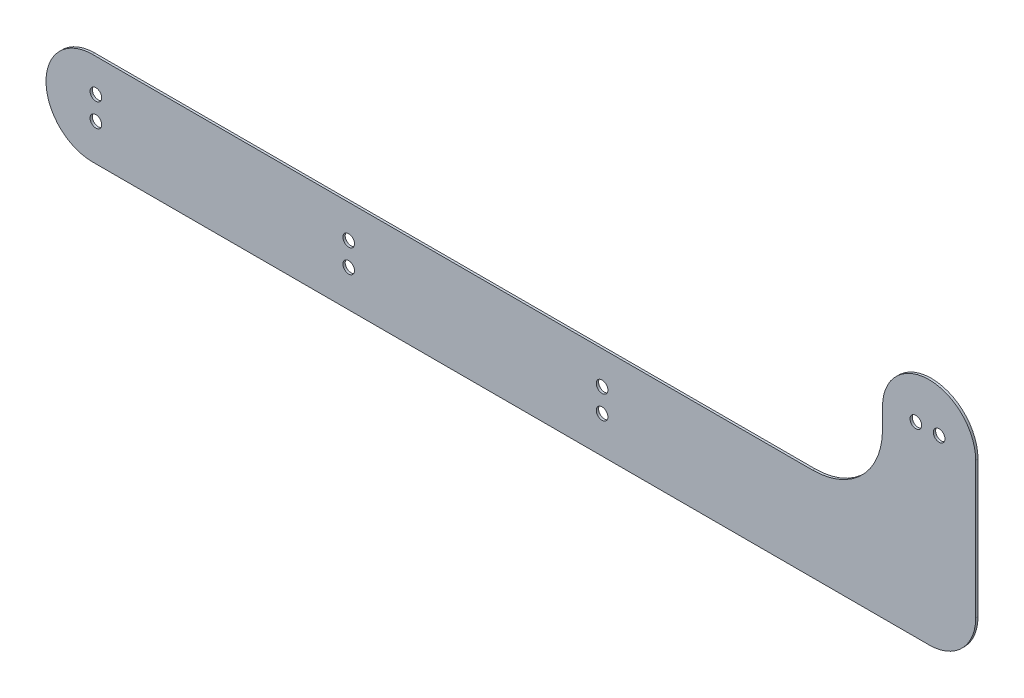
ISO-10303-21;
HEADER;
FILE_DESCRIPTION(('STEP AP214'),'2;1');
FILE_NAME('part.step','',(''),(''),'','','');
FILE_SCHEMA(('AUTOMOTIVE_DESIGN { 1 0 10303 214 1 1 1 1 }'));
ENDSEC;
DATA;
#1=APPLICATION_CONTEXT('core data for automotive mechanical design processes');
#2=APPLICATION_PROTOCOL_DEFINITION('international standard','automotive_design',2000,#1);
#3=PRODUCT_CONTEXT('',#1,'mechanical');
#4=PRODUCT('Part','Part','',(#3));
#5=PRODUCT_RELATED_PRODUCT_CATEGORY('part','',(#4));
#6=PRODUCT_DEFINITION_FORMATION('','',#4);
#7=PRODUCT_DEFINITION_CONTEXT('part definition',#1,'design');
#8=PRODUCT_DEFINITION('design','',#6,#7);
#9=PRODUCT_DEFINITION_SHAPE('','',#8);
#10=(LENGTH_UNIT() NAMED_UNIT(*) SI_UNIT(.MILLI.,.METRE.));
#11=(NAMED_UNIT(*) PLANE_ANGLE_UNIT() SI_UNIT($,.RADIAN.));
#12=(NAMED_UNIT(*) SI_UNIT($,.STERADIAN.) SOLID_ANGLE_UNIT());
#13=UNCERTAINTY_MEASURE_WITH_UNIT(LENGTH_MEASURE(1.E-05),#10,'distance_accuracy_value','');
#14=(GEOMETRIC_REPRESENTATION_CONTEXT(3) GLOBAL_UNCERTAINTY_ASSIGNED_CONTEXT((#13)) GLOBAL_UNIT_ASSIGNED_CONTEXT((#10,
#11,#12)) REPRESENTATION_CONTEXT('',''));
#15=CARTESIAN_POINT('',(0.,0.,0.));
#16=DIRECTION('',(0.,0.,1.));
#17=DIRECTION('',(1.,0.,0.));
#18=AXIS2_PLACEMENT_3D('',#15,#16,#17);
#19=CARTESIAN_POINT('',(422.807330172387,0.,1.));
#20=DIRECTION('',(-1.,0.,0.));
#21=DIRECTION('',(0.,0.,1.));
#22=AXIS2_PLACEMENT_3D('',#19,#20,#21);
#23=PLANE('',#22);
#24=DIRECTION('',(0.,1.,0.));
#25=VECTOR('',#24,1.);
#26=CARTESIAN_POINT('',(422.807330172387,0.,0.));
#27=LINE('',#26,#25);
#28=CARTESIAN_POINT('',(422.807330172387,62.2716161393578,0.));
#29=VERTEX_POINT('',#28);
#30=CARTESIAN_POINT('',(422.807330172387,70.9000000000001,0.));
#31=VERTEX_POINT('',#30);
#32=EDGE_CURVE('E170',#29,#31,#27,.T.);
#33=ORIENTED_EDGE('',*,*,#32,.F.);
#34=DIRECTION('',(0.,0.,-1.));
#35=VECTOR('',#34,1.);
#36=CARTESIAN_POINT('',(422.807330172387,62.2716161393578,1.));
#37=LINE('',#36,#35);
#38=CARTESIAN_POINT('',(422.807330172387,62.2716161393578,1.));
#39=VERTEX_POINT('',#38);
#40=EDGE_CURVE('E11',#39,#29,#37,.T.);
#41=ORIENTED_EDGE('',*,*,#40,.F.);
#42=DIRECTION('',(0.,1.,0.));
#43=VECTOR('',#42,1.);
#44=CARTESIAN_POINT('',(422.807330172387,0.,1.));
#45=LINE('',#44,#43);
#46=CARTESIAN_POINT('',(422.807330172387,70.9000000000001,1.));
#47=VERTEX_POINT('',#46);
#48=EDGE_CURVE('E466',#39,#47,#45,.T.);
#49=ORIENTED_EDGE('',*,*,#48,.T.);
#50=DIRECTION('',(0.,0.,-1.));
#51=VECTOR('',#50,1.);
#52=CARTESIAN_POINT('',(422.807330172387,70.9000000000001,1.));
#53=LINE('',#52,#51);
#54=EDGE_CURVE('E97',#47,#31,#53,.T.);
#55=ORIENTED_EDGE('',*,*,#54,.T.);
#56=EDGE_LOOP('',(#33,#41,#49,#55));
#57=FACE_BOUND('',#56,.T.);
#58=ADVANCED_FACE('F45',(#57),#23,.T.);
#59=CARTESIAN_POINT('',(392.807330172387,62.2716161393576,1.));
#60=DIRECTION('',(0.,0.,-1.));
#61=DIRECTION('',(-1.,0.,0.));
#62=AXIS2_PLACEMENT_3D('',#59,#60,#61);
#63=CYLINDRICAL_SURFACE('',#62,30.);
#64=CARTESIAN_POINT('',(392.807330172387,62.2716161393576,0.));
#65=DIRECTION('',(0.,0.,1.));
#66=DIRECTION('',(1.,0.,0.));
#67=AXIS2_PLACEMENT_3D('',#64,#65,#66);
#68=CIRCLE('',#67,30.);
#69=CARTESIAN_POINT('',(392.807330172387,32.2716161393576,0.));
#70=VERTEX_POINT('',#69);
#71=EDGE_CURVE('E167',#29,#70,#68,.F.);
#72=ORIENTED_EDGE('',*,*,#71,.T.);
#73=DIRECTION('',(0.,0.,-1.));
#74=VECTOR('',#73,1.);
#75=CARTESIAN_POINT('',(392.807330172387,32.2716161393576,1.));
#76=LINE('',#75,#74);
#77=CARTESIAN_POINT('',(392.807330172387,32.2716161393576,1.));
#78=VERTEX_POINT('',#77);
#79=EDGE_CURVE('E55',#78,#70,#76,.T.);
#80=ORIENTED_EDGE('',*,*,#79,.F.);
#81=CARTESIAN_POINT('',(392.807330172387,62.2716161393576,1.));
#82=DIRECTION('',(0.,0.,1.));
#83=DIRECTION('',(1.,0.,0.));
#84=AXIS2_PLACEMENT_3D('',#81,#82,#83);
#85=CIRCLE('',#84,30.);
#86=EDGE_CURVE('E462',#39,#78,#85,.F.);
#87=ORIENTED_EDGE('',*,*,#86,.F.);
#88=ORIENTED_EDGE('',*,*,#40,.T.);
#89=EDGE_LOOP('',(#72,#80,#87,#88));
#90=FACE_BOUND('',#89,.T.);
#91=ADVANCED_FACE('F168',(#90),#63,.F.);
#92=CARTESIAN_POINT('',(0.,32.2716161393576,1.));
#93=DIRECTION('',(0.,1.,0.));
#94=DIRECTION('',(-1.,0.,0.));
#95=AXIS2_PLACEMENT_3D('',#92,#93,#94);
#96=PLANE('',#95);
#97=DIRECTION('',(1.,0.,0.));
#98=VECTOR('',#97,1.);
#99=CARTESIAN_POINT('',(0.,32.2716161393576,0.));
#100=LINE('',#99,#98);
#101=CARTESIAN_POINT('',(83.711980445901,32.2716161393576,0.));
#102=VERTEX_POINT('',#101);
#103=EDGE_CURVE('E162',#102,#70,#100,.T.);
#104=ORIENTED_EDGE('',*,*,#103,.F.);
#105=DIRECTION('',(0.,0.,-1.));
#106=VECTOR('',#105,1.);
#107=CARTESIAN_POINT('',(83.711980445901,32.2716161393576,1.));
#108=LINE('',#107,#106);
#109=CARTESIAN_POINT('',(83.711980445901,32.2716161393576,1.));
#110=VERTEX_POINT('',#109);
#111=EDGE_CURVE('E152',#110,#102,#108,.T.);
#112=ORIENTED_EDGE('',*,*,#111,.F.);
#113=DIRECTION('',(1.,0.,0.));
#114=VECTOR('',#113,1.);
#115=CARTESIAN_POINT('',(0.,32.2716161393576,1.));
#116=LINE('',#115,#114);
#117=EDGE_CURVE('E164',#110,#78,#116,.T.);
#118=ORIENTED_EDGE('',*,*,#117,.T.);
#119=ORIENTED_EDGE('',*,*,#79,.T.);
#120=EDGE_LOOP('',(#104,#112,#118,#119));
#121=FACE_BOUND('',#120,.T.);
#122=ADVANCED_FACE('F160',(#121),#96,.T.);
#123=CARTESIAN_POINT('',(83.711980445901,12.2716161393576,1.));
#124=DIRECTION('',(0.,0.,-1.));
#125=DIRECTION('',(-1.,0.,0.));
#126=AXIS2_PLACEMENT_3D('',#123,#124,#125);
#127=CYLINDRICAL_SURFACE('',#126,20.);
#128=CARTESIAN_POINT('',(83.711980445901,12.2716161393576,0.));
#129=DIRECTION('',(0.,0.,1.));
#130=DIRECTION('',(1.,0.,0.));
#131=AXIS2_PLACEMENT_3D('',#128,#129,#130);
#132=CIRCLE('',#131,20.);
#133=CARTESIAN_POINT('',(83.711980445901,-7.72838386064238,0.));
#134=VERTEX_POINT('',#133);
#135=EDGE_CURVE('E175',#102,#134,#132,.T.);
#136=ORIENTED_EDGE('',*,*,#135,.T.);
#137=DIRECTION('',(0.,0.,-1.));
#138=VECTOR('',#137,1.);
#139=CARTESIAN_POINT('',(83.711980445901,-7.72838386064238,1.));
#140=LINE('',#139,#138);
#141=CARTESIAN_POINT('',(83.711980445901,-7.72838386064238,1.));
#142=VERTEX_POINT('',#141);
#143=EDGE_CURVE('E144',#142,#134,#140,.T.);
#144=ORIENTED_EDGE('',*,*,#143,.F.);
#145=CARTESIAN_POINT('',(83.711980445901,12.2716161393576,1.));
#146=DIRECTION('',(0.,0.,1.));
#147=DIRECTION('',(1.,0.,0.));
#148=AXIS2_PLACEMENT_3D('',#145,#146,#147);
#149=CIRCLE('',#148,20.);
#150=EDGE_CURVE('E459',#110,#142,#149,.T.);
#151=ORIENTED_EDGE('',*,*,#150,.F.);
#152=ORIENTED_EDGE('',*,*,#111,.T.);
#153=EDGE_LOOP('',(#136,#144,#151,#152));
#154=FACE_BOUND('',#153,.T.);
#155=ADVANCED_FACE('F311',(#154),#127,.T.);
#156=CARTESIAN_POINT('',(0.,-7.72838386064237,1.));
#157=DIRECTION('',(0.,1.,0.));
#158=DIRECTION('',(-1.,0.,0.));
#159=AXIS2_PLACEMENT_3D('',#156,#157,#158);
#160=PLANE('',#159);
#161=DIRECTION('',(1.,0.,0.));
#162=VECTOR('',#161,1.);
#163=CARTESIAN_POINT('',(0.,-7.72838386064237,0.));
#164=LINE('',#163,#162);
#165=CARTESIAN_POINT('',(442.807330172387,-7.72838386064238,0.));
#166=VERTEX_POINT('',#165);
#167=EDGE_CURVE('E179',#134,#166,#164,.T.);
#168=ORIENTED_EDGE('',*,*,#167,.T.);
#169=DIRECTION('',(0.,0.,-1.));
#170=VECTOR('',#169,1.);
#171=CARTESIAN_POINT('',(442.807330172387,-7.72838386064238,1.));
#172=LINE('',#171,#170);
#173=CARTESIAN_POINT('',(442.807330172387,-7.72838386064238,1.));
#174=VERTEX_POINT('',#173);
#175=EDGE_CURVE('E140',#174,#166,#172,.T.);
#176=ORIENTED_EDGE('',*,*,#175,.F.);
#177=DIRECTION('',(1.,0.,0.));
#178=VECTOR('',#177,1.);
#179=CARTESIAN_POINT('',(0.,-7.72838386064237,1.));
#180=LINE('',#179,#178);
#181=EDGE_CURVE('E131',#142,#174,#180,.T.);
#182=ORIENTED_EDGE('',*,*,#181,.F.);
#183=ORIENTED_EDGE('',*,*,#143,.T.);
#184=EDGE_LOOP('',(#168,#176,#182,#183));
#185=FACE_BOUND('',#184,.T.);
#186=ADVANCED_FACE('F308',(#185),#160,.F.);
#187=CARTESIAN_POINT('',(442.807330172387,12.2716161393576,1.));
#188=DIRECTION('',(0.,0.,-1.));
#189=DIRECTION('',(-1.,0.,0.));
#190=AXIS2_PLACEMENT_3D('',#187,#188,#189);
#191=CYLINDRICAL_SURFACE('',#190,20.);
#192=CARTESIAN_POINT('',(442.807330172387,12.2716161393576,0.));
#193=DIRECTION('',(0.,0.,1.));
#194=DIRECTION('',(1.,0.,0.));
#195=AXIS2_PLACEMENT_3D('',#192,#193,#194);
#196=CIRCLE('',#195,20.);
#197=CARTESIAN_POINT('',(462.807330172387,12.2716161393576,0.));
#198=VERTEX_POINT('',#197);
#199=EDGE_CURVE('E138',#166,#198,#196,.T.);
#200=ORIENTED_EDGE('',*,*,#199,.T.);
#201=DIRECTION('',(0.,0.,-1.));
#202=VECTOR('',#201,1.);
#203=CARTESIAN_POINT('',(462.807330172387,12.2716161393576,1.));
#204=LINE('',#203,#202);
#205=CARTESIAN_POINT('',(462.807330172387,12.2716161393576,1.));
#206=VERTEX_POINT('',#205);
#207=EDGE_CURVE('E122',#206,#198,#204,.T.);
#208=ORIENTED_EDGE('',*,*,#207,.F.);
#209=CARTESIAN_POINT('',(442.807330172387,12.2716161393576,1.));
#210=DIRECTION('',(0.,0.,1.));
#211=DIRECTION('',(1.,0.,0.));
#212=AXIS2_PLACEMENT_3D('',#209,#210,#211);
#213=CIRCLE('',#212,20.);
#214=EDGE_CURVE('E126',#174,#206,#213,.T.);
#215=ORIENTED_EDGE('',*,*,#214,.F.);
#216=ORIENTED_EDGE('',*,*,#175,.T.);
#217=EDGE_LOOP('',(#200,#208,#215,#216));
#218=FACE_BOUND('',#217,.T.);
#219=ADVANCED_FACE('F137',(#218),#191,.T.);
#220=CARTESIAN_POINT('',(462.807330172387,0.,1.));
#221=DIRECTION('',(-1.,0.,0.));
#222=DIRECTION('',(0.,0.,1.));
#223=AXIS2_PLACEMENT_3D('',#220,#221,#222);
#224=PLANE('',#223);
#225=DIRECTION('',(0.,1.,0.));
#226=VECTOR('',#225,1.);
#227=CARTESIAN_POINT('',(462.807330172387,0.,0.));
#228=LINE('',#227,#226);
#229=CARTESIAN_POINT('',(462.807330172387,70.9000000000001,0.));
#230=VERTEX_POINT('',#229);
#231=EDGE_CURVE('E188',#198,#230,#228,.T.);
#232=ORIENTED_EDGE('',*,*,#231,.T.);
#233=DIRECTION('',(0.,0.,-1.));
#234=VECTOR('',#233,1.);
#235=CARTESIAN_POINT('',(462.807330172387,70.9000000000001,1.));
#236=LINE('',#235,#234);
#237=CARTESIAN_POINT('',(462.807330172387,70.9000000000001,1.));
#238=VERTEX_POINT('',#237);
#239=EDGE_CURVE('E124',#238,#230,#236,.T.);
#240=ORIENTED_EDGE('',*,*,#239,.F.);
#241=DIRECTION('',(0.,1.,0.));
#242=VECTOR('',#241,1.);
#243=CARTESIAN_POINT('',(462.807330172387,0.,1.));
#244=LINE('',#243,#242);
#245=EDGE_CURVE('E117',#206,#238,#244,.T.);
#246=ORIENTED_EDGE('',*,*,#245,.F.);
#247=ORIENTED_EDGE('',*,*,#207,.T.);
#248=EDGE_LOOP('',(#232,#240,#246,#247));
#249=FACE_BOUND('',#248,.T.);
#250=ADVANCED_FACE('F120',(#249),#224,.F.);
#251=CARTESIAN_POINT('',(85.1298589846822,18.0818747044437,1.));
#252=DIRECTION('',(0.,0.,-1.));
#253=DIRECTION('',(-1.,0.,0.));
#254=AXIS2_PLACEMENT_3D('',#251,#252,#253);
#255=CYLINDRICAL_SURFACE('',#254,2.50000000000001);
#256=CARTESIAN_POINT('',(85.1298589846822,18.0818747044437,1.));
#257=DIRECTION('',(0.,0.,1.));
#258=DIRECTION('',(1.,0.,0.));
#259=AXIS2_PLACEMENT_3D('',#256,#257,#258);
#260=CIRCLE('',#259,2.50000000000001);
#261=CARTESIAN_POINT('',(87.6298589846822,18.0818747044437,1.));
#262=VERTEX_POINT('',#261);
#263=EDGE_CURVE('E473',#262,#262,#260,.T.);
#264=ORIENTED_EDGE('',*,*,#263,.T.);
#265=EDGE_LOOP('',(#264));
#266=FACE_BOUND('',#265,.T.);
#267=CARTESIAN_POINT('',(85.1298589846822,18.0818747044437,0.));
#268=DIRECTION('',(0.,0.,1.));
#269=DIRECTION('',(1.,0.,0.));
#270=AXIS2_PLACEMENT_3D('',#267,#268,#269);
#271=CIRCLE('',#270,2.50000000000001);
#272=CARTESIAN_POINT('',(87.6298589846822,18.0818747044437,0.));
#273=VERTEX_POINT('',#272);
#274=EDGE_CURVE('E225',#273,#273,#271,.T.);
#275=ORIENTED_EDGE('',*,*,#274,.F.);
#276=EDGE_LOOP('',(#275));
#277=FACE_BOUND('',#276,.T.);
#278=ADVANCED_FACE('F237',(#266,#277),#255,.F.);
#279=CARTESIAN_POINT('',(85.1135216153479,8.08188804993442,1.));
#280=DIRECTION('',(0.,0.,-1.));
#281=DIRECTION('',(-1.,0.,0.));
#282=AXIS2_PLACEMENT_3D('',#279,#280,#281);
#283=CYLINDRICAL_SURFACE('',#282,2.5);
#284=CARTESIAN_POINT('',(85.1135216153479,8.08188804993442,1.));
#285=DIRECTION('',(0.,0.,1.));
#286=DIRECTION('',(1.,0.,0.));
#287=AXIS2_PLACEMENT_3D('',#284,#285,#286);
#288=CIRCLE('',#287,2.5);
#289=CARTESIAN_POINT('',(87.6135216153479,8.08188804993442,1.));
#290=VERTEX_POINT('',#289);
#291=EDGE_CURVE('E477',#290,#290,#288,.T.);
#292=ORIENTED_EDGE('',*,*,#291,.T.);
#293=EDGE_LOOP('',(#292));
#294=FACE_BOUND('',#293,.T.);
#295=CARTESIAN_POINT('',(85.1135216153479,8.08188804993442,0.));
#296=DIRECTION('',(0.,0.,1.));
#297=DIRECTION('',(1.,0.,0.));
#298=AXIS2_PLACEMENT_3D('',#295,#296,#297);
#299=CIRCLE('',#298,2.5);
#300=CARTESIAN_POINT('',(87.6135216153479,8.08188804993442,0.));
#301=VERTEX_POINT('',#300);
#302=EDGE_CURVE('E221',#301,#301,#299,.T.);
#303=ORIENTED_EDGE('',*,*,#302,.F.);
#304=EDGE_LOOP('',(#303));
#305=FACE_BOUND('',#304,.T.);
#306=ADVANCED_FACE('F240',(#294,#305),#283,.F.);
#307=CARTESIAN_POINT('',(193.662739563999,18.0818880499344,1.));
#308=DIRECTION('',(0.,0.,-1.));
#309=DIRECTION('',(-1.,0.,0.));
#310=AXIS2_PLACEMENT_3D('',#307,#308,#309);
#311=CYLINDRICAL_SURFACE('',#310,2.5);
#312=CARTESIAN_POINT('',(193.662739563999,18.0818880499344,1.));
#313=DIRECTION('',(0.,0.,1.));
#314=DIRECTION('',(1.,0.,0.));
#315=AXIS2_PLACEMENT_3D('',#312,#313,#314);
#316=CIRCLE('',#315,2.5);
#317=CARTESIAN_POINT('',(196.162739563999,18.0818880499344,1.));
#318=VERTEX_POINT('',#317);
#319=EDGE_CURVE('E481',#318,#318,#316,.T.);
#320=ORIENTED_EDGE('',*,*,#319,.T.);
#321=EDGE_LOOP('',(#320));
#322=FACE_BOUND('',#321,.T.);
#323=CARTESIAN_POINT('',(193.662739563999,18.0818880499344,0.));
#324=DIRECTION('',(0.,0.,1.));
#325=DIRECTION('',(1.,0.,0.));
#326=AXIS2_PLACEMENT_3D('',#323,#324,#325);
#327=CIRCLE('',#326,2.5);
#328=CARTESIAN_POINT('',(196.162739563999,18.0818880499344,0.));
#329=VERTEX_POINT('',#328);
#330=EDGE_CURVE('E217',#329,#329,#327,.T.);
#331=ORIENTED_EDGE('',*,*,#330,.F.);
#332=EDGE_LOOP('',(#331));
#333=FACE_BOUND('',#332,.T.);
#334=ADVANCED_FACE('F244',(#322,#333),#311,.F.);
#335=CARTESIAN_POINT('',(193.662739563999,8.08188804993442,1.));
#336=DIRECTION('',(0.,0.,-1.));
#337=DIRECTION('',(-1.,0.,0.));
#338=AXIS2_PLACEMENT_3D('',#335,#336,#337);
#339=CYLINDRICAL_SURFACE('',#338,2.5);
#340=CARTESIAN_POINT('',(193.662739563999,8.08188804993442,1.));
#341=DIRECTION('',(0.,0.,1.));
#342=DIRECTION('',(1.,0.,0.));
#343=AXIS2_PLACEMENT_3D('',#340,#341,#342);
#344=CIRCLE('',#343,2.5);
#345=CARTESIAN_POINT('',(196.162739563999,8.08188804993442,1.));
#346=VERTEX_POINT('',#345);
#347=EDGE_CURVE('E485',#346,#346,#344,.T.);
#348=ORIENTED_EDGE('',*,*,#347,.T.);
#349=EDGE_LOOP('',(#348));
#350=FACE_BOUND('',#349,.T.);
#351=CARTESIAN_POINT('',(193.662739563999,8.08188804993442,0.));
#352=DIRECTION('',(0.,0.,1.));
#353=DIRECTION('',(1.,0.,0.));
#354=AXIS2_PLACEMENT_3D('',#351,#352,#353);
#355=CIRCLE('',#354,2.5);
#356=CARTESIAN_POINT('',(196.162739563999,8.08188804993442,0.));
#357=VERTEX_POINT('',#356);
#358=EDGE_CURVE('E213',#357,#357,#355,.T.);
#359=ORIENTED_EDGE('',*,*,#358,.F.);
#360=EDGE_LOOP('',(#359));
#361=FACE_BOUND('',#360,.T.);
#362=ADVANCED_FACE('F248',(#350,#361),#339,.F.);
#363=CARTESIAN_POINT('',(302.426453747017,18.0818880499344,1.));
#364=DIRECTION('',(0.,0.,-1.));
#365=DIRECTION('',(-1.,0.,0.));
#366=AXIS2_PLACEMENT_3D('',#363,#364,#365);
#367=CYLINDRICAL_SURFACE('',#366,2.50000000000002);
#368=CARTESIAN_POINT('',(302.426453747017,18.0818880499344,1.));
#369=DIRECTION('',(0.,0.,1.));
#370=DIRECTION('',(1.,0.,0.));
#371=AXIS2_PLACEMENT_3D('',#368,#369,#370);
#372=CIRCLE('',#371,2.50000000000002);
#373=CARTESIAN_POINT('',(304.926453747017,18.0818880499344,1.));
#374=VERTEX_POINT('',#373);
#375=EDGE_CURVE('E489',#374,#374,#372,.T.);
#376=ORIENTED_EDGE('',*,*,#375,.T.);
#377=EDGE_LOOP('',(#376));
#378=FACE_BOUND('',#377,.T.);
#379=CARTESIAN_POINT('',(302.426453747017,18.0818880499344,0.));
#380=DIRECTION('',(0.,0.,1.));
#381=DIRECTION('',(1.,0.,0.));
#382=AXIS2_PLACEMENT_3D('',#379,#380,#381);
#383=CIRCLE('',#382,2.50000000000002);
#384=CARTESIAN_POINT('',(304.926453747017,18.0818880499344,0.));
#385=VERTEX_POINT('',#384);
#386=EDGE_CURVE('E209',#385,#385,#383,.T.);
#387=ORIENTED_EDGE('',*,*,#386,.F.);
#388=EDGE_LOOP('',(#387));
#389=FACE_BOUND('',#388,.T.);
#390=ADVANCED_FACE('F252',(#378,#389),#367,.F.);
#391=CARTESIAN_POINT('',(302.426453747017,8.08188804993442,1.));
#392=DIRECTION('',(0.,0.,-1.));
#393=DIRECTION('',(-1.,0.,0.));
#394=AXIS2_PLACEMENT_3D('',#391,#392,#393);
#395=CYLINDRICAL_SURFACE('',#394,2.50000000000002);
#396=CARTESIAN_POINT('',(302.426453747017,8.08188804993442,1.));
#397=DIRECTION('',(0.,0.,1.));
#398=DIRECTION('',(1.,0.,0.));
#399=AXIS2_PLACEMENT_3D('',#396,#397,#398);
#400=CIRCLE('',#399,2.50000000000002);
#401=CARTESIAN_POINT('',(304.926453747017,8.08188804993442,1.));
#402=VERTEX_POINT('',#401);
#403=EDGE_CURVE('E493',#402,#402,#400,.T.);
#404=ORIENTED_EDGE('',*,*,#403,.T.);
#405=EDGE_LOOP('',(#404));
#406=FACE_BOUND('',#405,.T.);
#407=CARTESIAN_POINT('',(302.426453747017,8.08188804993442,0.));
#408=DIRECTION('',(0.,0.,1.));
#409=DIRECTION('',(1.,0.,0.));
#410=AXIS2_PLACEMENT_3D('',#407,#408,#409);
#411=CIRCLE('',#410,2.50000000000002);
#412=CARTESIAN_POINT('',(304.926453747017,8.08188804993442,0.));
#413=VERTEX_POINT('',#412);
#414=EDGE_CURVE('E205',#413,#413,#411,.T.);
#415=ORIENTED_EDGE('',*,*,#414,.F.);
#416=EDGE_LOOP('',(#415));
#417=FACE_BOUND('',#416,.T.);
#418=ADVANCED_FACE('F256',(#406,#417),#395,.F.);
#419=CARTESIAN_POINT('',(437.123899958384,72.2992757420183,1.));
#420=DIRECTION('',(0.,0.,-1.));
#421=DIRECTION('',(-1.,0.,0.));
#422=AXIS2_PLACEMENT_3D('',#419,#420,#421);
#423=CYLINDRICAL_SURFACE('',#422,2.50000000000002);
#424=CARTESIAN_POINT('',(437.123899958384,72.2992757420183,1.));
#425=DIRECTION('',(0.,0.,1.));
#426=DIRECTION('',(1.,0.,0.));
#427=AXIS2_PLACEMENT_3D('',#424,#425,#426);
#428=CIRCLE('',#427,2.50000000000002);
#429=CARTESIAN_POINT('',(439.623899958384,72.2992757420183,1.));
#430=VERTEX_POINT('',#429);
#431=EDGE_CURVE('E271',#430,#430,#428,.T.);
#432=ORIENTED_EDGE('',*,*,#431,.T.);
#433=EDGE_LOOP('',(#432));
#434=FACE_BOUND('',#433,.T.);
#435=CARTESIAN_POINT('',(437.123899958384,72.2992757420183,0.));
#436=DIRECTION('',(0.,0.,1.));
#437=DIRECTION('',(1.,0.,0.));
#438=AXIS2_PLACEMENT_3D('',#435,#436,#437);
#439=CIRCLE('',#438,2.50000000000002);
#440=CARTESIAN_POINT('',(439.623899958384,72.2992757420183,0.));
#441=VERTEX_POINT('',#440);
#442=EDGE_CURVE('E201',#441,#441,#439,.T.);
#443=ORIENTED_EDGE('',*,*,#442,.F.);
#444=EDGE_LOOP('',(#443));
#445=FACE_BOUND('',#444,.T.);
#446=ADVANCED_FACE('F259',(#434,#445),#423,.F.);
#447=CARTESIAN_POINT('',(447.123892988846,72.2874693578521,1.));
#448=DIRECTION('',(0.,0.,-1.));
#449=DIRECTION('',(-1.,0.,0.));
#450=AXIS2_PLACEMENT_3D('',#447,#448,#449);
#451=CYLINDRICAL_SURFACE('',#450,2.50000000000002);
#452=CARTESIAN_POINT('',(447.123892988846,72.2874693578521,1.));
#453=DIRECTION('',(0.,0.,1.));
#454=DIRECTION('',(1.,0.,0.));
#455=AXIS2_PLACEMENT_3D('',#452,#453,#454);
#456=CIRCLE('',#455,2.50000000000002);
#457=CARTESIAN_POINT('',(449.623892988846,72.2874693578521,1.));
#458=VERTEX_POINT('',#457);
#459=EDGE_CURVE('E192',#458,#458,#456,.T.);
#460=ORIENTED_EDGE('',*,*,#459,.T.);
#461=EDGE_LOOP('',(#460));
#462=FACE_BOUND('',#461,.T.);
#463=CARTESIAN_POINT('',(447.123892988846,72.2874693578521,0.));
#464=DIRECTION('',(0.,0.,1.));
#465=DIRECTION('',(1.,0.,0.));
#466=AXIS2_PLACEMENT_3D('',#463,#464,#465);
#467=CIRCLE('',#466,2.50000000000002);
#468=CARTESIAN_POINT('',(449.623892988846,72.2874693578521,0.));
#469=VERTEX_POINT('',#468);
#470=EDGE_CURVE('E197',#469,#469,#467,.T.);
#471=ORIENTED_EDGE('',*,*,#470,.F.);
#472=EDGE_LOOP('',(#471));
#473=FACE_BOUND('',#472,.T.);
#474=ADVANCED_FACE('F47',(#462,#473),#451,.F.);
#475=CARTESIAN_POINT('',(442.807330172387,70.9000000000001,1.));
#476=DIRECTION('',(0.,0.,-1.));
#477=DIRECTION('',(-1.,0.,0.));
#478=AXIS2_PLACEMENT_3D('',#475,#476,#477);
#479=CYLINDRICAL_SURFACE('',#478,20.);
#480=CARTESIAN_POINT('',(442.807330172387,70.9000000000001,0.));
#481=DIRECTION('',(0.,0.,1.));
#482=DIRECTION('',(1.,0.,0.));
#483=AXIS2_PLACEMENT_3D('',#480,#481,#482);
#484=CIRCLE('',#483,20.);
#485=EDGE_CURVE('E90',#230,#31,#484,.T.);
#486=ORIENTED_EDGE('',*,*,#485,.T.);
#487=ORIENTED_EDGE('',*,*,#54,.F.);
#488=CARTESIAN_POINT('',(442.807330172387,70.9000000000001,1.));
#489=DIRECTION('',(0.,0.,1.));
#490=DIRECTION('',(1.,0.,0.));
#491=AXIS2_PLACEMENT_3D('',#488,#489,#490);
#492=CIRCLE('',#491,20.);
#493=EDGE_CURVE('E63',#238,#47,#492,.T.);
#494=ORIENTED_EDGE('',*,*,#493,.F.);
#495=ORIENTED_EDGE('',*,*,#239,.T.);
#496=EDGE_LOOP('',(#486,#487,#494,#495));
#497=FACE_BOUND('',#496,.T.);
#498=ADVANCED_FACE('F266',(#497),#479,.T.);
#499=CARTESIAN_POINT('',(0.,0.,1.));
#500=DIRECTION('',(0.,0.,1.));
#501=DIRECTION('',(1.,0.,0.));
#502=AXIS2_PLACEMENT_3D('',#499,#500,#501);
#503=PLANE('',#502);
#504=ORIENTED_EDGE('',*,*,#459,.F.);
#505=EDGE_LOOP('',(#504));
#506=FACE_BOUND('',#505,.T.);
#507=ORIENTED_EDGE('',*,*,#431,.F.);
#508=EDGE_LOOP('',(#507));
#509=FACE_BOUND('',#508,.T.);
#510=ORIENTED_EDGE('',*,*,#403,.F.);
#511=EDGE_LOOP('',(#510));
#512=FACE_BOUND('',#511,.T.);
#513=ORIENTED_EDGE('',*,*,#375,.F.);
#514=EDGE_LOOP('',(#513));
#515=FACE_BOUND('',#514,.T.);
#516=ORIENTED_EDGE('',*,*,#347,.F.);
#517=EDGE_LOOP('',(#516));
#518=FACE_BOUND('',#517,.T.);
#519=ORIENTED_EDGE('',*,*,#319,.F.);
#520=EDGE_LOOP('',(#519));
#521=FACE_BOUND('',#520,.T.);
#522=ORIENTED_EDGE('',*,*,#291,.F.);
#523=EDGE_LOOP('',(#522));
#524=FACE_BOUND('',#523,.T.);
#525=ORIENTED_EDGE('',*,*,#263,.F.);
#526=EDGE_LOOP('',(#525));
#527=FACE_BOUND('',#526,.T.);
#528=ORIENTED_EDGE('',*,*,#48,.F.);
#529=ORIENTED_EDGE('',*,*,#86,.T.);
#530=ORIENTED_EDGE('',*,*,#117,.F.);
#531=ORIENTED_EDGE('',*,*,#150,.T.);
#532=ORIENTED_EDGE('',*,*,#181,.T.);
#533=ORIENTED_EDGE('',*,*,#214,.T.);
#534=ORIENTED_EDGE('',*,*,#245,.T.);
#535=ORIENTED_EDGE('',*,*,#493,.T.);
#536=EDGE_LOOP('',(#528,#529,#530,#531,#532,#533,#534,#535));
#537=FACE_BOUND('',#536,.T.);
#538=ADVANCED_FACE('F129',(#506,#509,#512,#515,#518,#521,#524,#527,#537),#503,.T.);
#539=CARTESIAN_POINT('',(0.,0.,0.));
#540=DIRECTION('',(0.,0.,1.));
#541=DIRECTION('',(1.,0.,0.));
#542=AXIS2_PLACEMENT_3D('',#539,#540,#541);
#543=PLANE('',#542);
#544=ORIENTED_EDGE('',*,*,#470,.T.);
#545=EDGE_LOOP('',(#544));
#546=FACE_BOUND('',#545,.T.);
#547=ORIENTED_EDGE('',*,*,#442,.T.);
#548=EDGE_LOOP('',(#547));
#549=FACE_BOUND('',#548,.T.);
#550=ORIENTED_EDGE('',*,*,#414,.T.);
#551=EDGE_LOOP('',(#550));
#552=FACE_BOUND('',#551,.T.);
#553=ORIENTED_EDGE('',*,*,#386,.T.);
#554=EDGE_LOOP('',(#553));
#555=FACE_BOUND('',#554,.T.);
#556=ORIENTED_EDGE('',*,*,#358,.T.);
#557=EDGE_LOOP('',(#556));
#558=FACE_BOUND('',#557,.T.);
#559=ORIENTED_EDGE('',*,*,#330,.T.);
#560=EDGE_LOOP('',(#559));
#561=FACE_BOUND('',#560,.T.);
#562=ORIENTED_EDGE('',*,*,#302,.T.);
#563=EDGE_LOOP('',(#562));
#564=FACE_BOUND('',#563,.T.);
#565=ORIENTED_EDGE('',*,*,#274,.T.);
#566=EDGE_LOOP('',(#565));
#567=FACE_BOUND('',#566,.T.);
#568=ORIENTED_EDGE('',*,*,#32,.T.);
#569=ORIENTED_EDGE('',*,*,#485,.F.);
#570=ORIENTED_EDGE('',*,*,#231,.F.);
#571=ORIENTED_EDGE('',*,*,#199,.F.);
#572=ORIENTED_EDGE('',*,*,#167,.F.);
#573=ORIENTED_EDGE('',*,*,#135,.F.);
#574=ORIENTED_EDGE('',*,*,#103,.T.);
#575=ORIENTED_EDGE('',*,*,#71,.F.);
#576=EDGE_LOOP('',(#568,#569,#570,#571,#572,#573,#574,#575));
#577=FACE_BOUND('',#576,.T.);
#578=ADVANCED_FACE('F173',(#546,#549,#552,#555,#558,#561,#564,#567,#577),#543,.F.);
#579=CLOSED_SHELL('',(#58,#91,#122,#155,#186,#219,#250,#278,#306,#334,#362,#390,#418,#446,#474,
#498,#538,#578));
#580=MANIFOLD_SOLID_BREP('B2',#579);
#581=ADVANCED_BREP_SHAPE_REPRESENTATION('',(#18,#580),#14);
#582=SHAPE_DEFINITION_REPRESENTATION(#9,#581);
ENDSEC;
END-ISO-10303-21;
